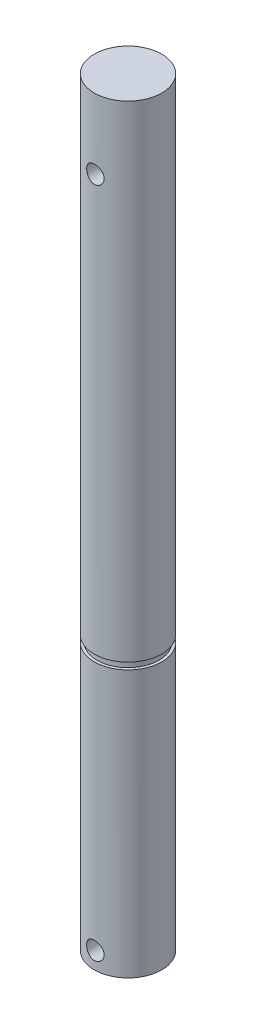
ISO-10303-21;
HEADER;
FILE_DESCRIPTION(('STEP AP214'),'2;1');
FILE_NAME('part.step','',(''),(''),'','','');
FILE_SCHEMA(('AUTOMOTIVE_DESIGN { 1 0 10303 214 1 1 1 1 }'));
ENDSEC;
DATA;
#1=APPLICATION_CONTEXT('core data for automotive mechanical design processes');
#2=APPLICATION_PROTOCOL_DEFINITION('international standard','automotive_design',2000,#1);
#3=PRODUCT_CONTEXT('',#1,'mechanical');
#4=PRODUCT('Part','Part','',(#3));
#5=PRODUCT_RELATED_PRODUCT_CATEGORY('part','',(#4));
#6=PRODUCT_DEFINITION_FORMATION('','',#4);
#7=PRODUCT_DEFINITION_CONTEXT('part definition',#1,'design');
#8=PRODUCT_DEFINITION('design','',#6,#7);
#9=PRODUCT_DEFINITION_SHAPE('','',#8);
#10=(LENGTH_UNIT() NAMED_UNIT(*) SI_UNIT(.MILLI.,.METRE.));
#11=(NAMED_UNIT(*) PLANE_ANGLE_UNIT() SI_UNIT($,.RADIAN.));
#12=(NAMED_UNIT(*) SI_UNIT($,.STERADIAN.) SOLID_ANGLE_UNIT());
#13=UNCERTAINTY_MEASURE_WITH_UNIT(LENGTH_MEASURE(1.E-05),#10,'distance_accuracy_value','');
#14=(GEOMETRIC_REPRESENTATION_CONTEXT(3) GLOBAL_UNCERTAINTY_ASSIGNED_CONTEXT((#13)) GLOBAL_UNIT_ASSIGNED_CONTEXT((#10,
#11,#12)) REPRESENTATION_CONTEXT('',''));
#15=CARTESIAN_POINT('',(0.,0.,0.));
#16=DIRECTION('',(0.,0.,1.));
#17=DIRECTION('',(1.,0.,0.));
#18=AXIS2_PLACEMENT_3D('',#15,#16,#17);
#19=CARTESIAN_POINT('',(0.,38.1,0.));
#20=DIRECTION('',(0.,-1.,0.));
#21=DIRECTION('',(0.,0.,-1.));
#22=AXIS2_PLACEMENT_3D('',#19,#20,#21);
#23=CYLINDRICAL_SURFACE('',#22,3.175);
#24=CARTESIAN_POINT('',(0.,-8.24230000000151,0.));
#25=DIRECTION('',(0.,-1.,0.));
#26=DIRECTION('',(1.,0.,0.));
#27=AXIS2_PLACEMENT_3D('',#24,#25,#26);
#28=CIRCLE('',#27,3.17500000000024);
#29=CARTESIAN_POINT('',(3.17500000000018,-8.24230000000153,0.));
#30=VERTEX_POINT('',#29);
#31=EDGE_CURVE('E85',#30,#30,#28,.T.);
#32=ORIENTED_EDGE('',*,*,#31,.T.);
#33=EDGE_LOOP('',(#32));
#34=FACE_BOUND('',#33,.T.);
#35=CARTESIAN_POINT('',(0.,-30.9181499999997,-3.175));
#36=CARTESIAN_POINT('',(-0.0455490444564716,-30.9181511646776,-3.17499927554408));
#37=CARTESIAN_POINT('',(-0.0911107772315206,-30.9219325825618,-3.17401012453183));
#38=CARTESIAN_POINT('',(-0.180924462571168,-30.9369332522701,-3.17016017836612));
#39=CARTESIAN_POINT('',(-0.225175727003084,-30.9481563418591,-3.16729841749395));
#40=CARTESIAN_POINT('',(-0.311058847949402,-30.9776528692705,-3.16001953568299));
#41=CARTESIAN_POINT('',(-0.352693912176376,-30.995917469299,-3.1556043650322));
#42=CARTESIAN_POINT('',(-0.432309574750794,-31.0389464647744,-3.14568673488206));
#43=CARTESIAN_POINT('',(-0.470289977745236,-31.0637112074107,-3.14018421730859));
#44=CARTESIAN_POINT('',(-0.542358916081396,-31.1196163924182,-3.1285511255792));
#45=CARTESIAN_POINT('',(-0.576355024960985,-31.1508738419514,-3.12241023686842));
#46=CARTESIAN_POINT('',(-0.638686440557507,-31.2186268750115,-3.11025967562153));
#47=CARTESIAN_POINT('',(-0.667021055984994,-31.2551230972783,-3.10425001918907));
#48=CARTESIAN_POINT('',(-0.717669305807227,-31.3330472453525,-3.09293747588305));
#49=CARTESIAN_POINT('',(-0.739877808562356,-31.3745455707403,-3.08764763606786));
#50=CARTESIAN_POINT('',(-0.776966698788749,-31.4608466590459,-3.07852481880321));
#51=CARTESIAN_POINT('',(-0.791848363714491,-31.5056488443592,-3.07469158741664));
#52=CARTESIAN_POINT('',(-0.813542460350865,-31.5962651979148,-3.06902229812762));
#53=CARTESIAN_POINT('',(-0.820521906643798,-31.6420367383294,-3.06714497298997));
#54=CARTESIAN_POINT('',(-0.826733950842547,-31.7341365760683,-3.06547666474802));
#55=CARTESIAN_POINT('',(-0.825967919338086,-31.7804647734409,-3.06568531252335));
#56=CARTESIAN_POINT('',(-0.816843613992,-31.8710689176488,-3.06812837577967));
#57=CARTESIAN_POINT('',(-0.80868616989106,-31.9153667621734,-3.07030920275975));
#58=CARTESIAN_POINT('',(-0.785331729461165,-32.0019424663515,-3.07636525914382));
#59=CARTESIAN_POINT('',(-0.77013419533119,-32.0442201714119,-3.08024061799389));
#60=CARTESIAN_POINT('',(-0.73296429277048,-32.1260850818811,-3.08929704174821));
#61=CARTESIAN_POINT('',(-0.710920512156943,-32.1656382893351,-3.09449175940506));
#62=CARTESIAN_POINT('',(-0.660733727053371,-32.2405554196189,-3.10559409871122));
#63=CARTESIAN_POINT('',(-0.632589575825033,-32.2759185528693,-3.11150185430367));
#64=CARTESIAN_POINT('',(-0.56996863358989,-32.3426005545741,-3.12358872711053));
#65=CARTESIAN_POINT('',(-0.53532285439119,-32.3737604433018,-3.12977058489188));
#66=CARTESIAN_POINT('',(-0.461222592708053,-32.4298594919214,-3.14154484108114));
#67=CARTESIAN_POINT('',(-0.421767938840292,-32.4547984300085,-3.14713721846733));
#68=CARTESIAN_POINT('',(-0.338931601167057,-32.4978128812965,-3.15713404940261));
#69=CARTESIAN_POINT('',(-0.295534986205322,-32.5158608265384,-3.1615337114748));
#70=CARTESIAN_POINT('',(-0.206183396301658,-32.5443599168877,-3.16861468064551));
#71=CARTESIAN_POINT('',(-0.160228954065163,-32.554812637487,-3.1712963440981));
#72=CARTESIAN_POINT('',(-0.0684239586743234,-32.5675777285026,-3.17458574406668));
#73=CARTESIAN_POINT('',(-0.0226054081557788,-32.5701063859497,-3.17524857017345));
#74=CARTESIAN_POINT('',(0.0688006995751029,-32.5675472110495,-3.17458339572571));
#75=CARTESIAN_POINT('',(0.114388278961209,-32.5624601242867,-3.17325559005482));
#76=CARTESIAN_POINT('',(0.203274715269327,-32.5449916424451,-3.16879381748649));
#77=CARTESIAN_POINT('',(0.246598691909961,-32.5327298092317,-3.1656894735007));
#78=CARTESIAN_POINT('',(0.330571383093773,-32.5013978167975,-3.15802578773359));
#79=CARTESIAN_POINT('',(0.371219814811472,-32.4823269391734,-3.15346629242869));
#80=CARTESIAN_POINT('',(0.449536179930653,-32.4375097314605,-3.14326779757461));
#81=CARTESIAN_POINT('',(0.487133469185669,-32.4116443210533,-3.13761006575121));
#82=CARTESIAN_POINT('',(0.557530280334611,-32.354122984244,-3.12586961024121));
#83=CARTESIAN_POINT('',(0.590328901114482,-32.3224659727763,-3.11978680704899));
#84=CARTESIAN_POINT('',(0.651100635474968,-32.2532526746999,-3.10768085425103));
#85=CARTESIAN_POINT('',(0.678921487901201,-32.2155614209022,-3.10166363600489));
#86=CARTESIAN_POINT('',(0.72784524484951,-32.1359193238853,-3.09054980997123));
#87=CARTESIAN_POINT('',(0.748948439062981,-32.093968664451,-3.08545316248925));
#88=CARTESIAN_POINT('',(0.783679117411295,-32.0072155734125,-3.07681531259225));
#89=CARTESIAN_POINT('',(0.797350495109814,-31.9624316693394,-3.07326500256863));
#90=CARTESIAN_POINT('',(0.81693857263891,-31.8710934110704,-3.0681168301153));
#91=CARTESIAN_POINT('',(0.822857136007982,-31.8245394851028,-3.06651849849617));
#92=CARTESIAN_POINT('',(0.826668323885045,-31.7325376056019,-3.06549306340449));
#93=CARTESIAN_POINT('',(0.824805100001955,-31.6871003467695,-3.06599990777189));
#94=CARTESIAN_POINT('',(0.813668869986645,-31.5972118465091,-3.0689738539894));
#95=CARTESIAN_POINT('',(0.804396037010227,-31.5527605820644,-3.07144091003115));
#96=CARTESIAN_POINT('',(0.778842083577236,-31.4663961241537,-3.07801899221736));
#97=CARTESIAN_POINT('',(0.762610281236707,-31.4244673944751,-3.08211843536613));
#98=CARTESIAN_POINT('',(0.723637682259986,-31.3438972876927,-3.09150019493008));
#99=CARTESIAN_POINT('',(0.700895911604898,-31.3052564036382,-3.09678268832701));
#100=CARTESIAN_POINT('',(0.648798632693577,-31.2311875582838,-3.10812062045323));
#101=CARTESIAN_POINT('',(0.619275367319419,-31.1958802583928,-3.11419359607686));
#102=CARTESIAN_POINT('',(0.554775411134822,-31.1306416535094,-3.1263275975947));
#103=CARTESIAN_POINT('',(0.519797409689423,-31.1007116442731,-3.13238862026157));
#104=CARTESIAN_POINT('',(0.444535305328722,-31.0464897572141,-3.14396086896678));
#105=CARTESIAN_POINT('',(0.404158949775694,-31.0223228272188,-3.14945864995091));
#106=CARTESIAN_POINT('',(0.319775904451884,-30.9811580024063,-3.15914011172934));
#107=CARTESIAN_POINT('',(0.275771679860848,-30.9641552866524,-3.163324675727));
#108=CARTESIAN_POINT('',(0.193246051545757,-30.9401446621499,-3.16933532392994));
#109=CARTESIAN_POINT('',(0.155096102604298,-30.9319152715346,-3.1714444631155));
#110=CARTESIAN_POINT('',(0.0779671520321311,-30.9209176840155,-3.17427704979612));
#111=CARTESIAN_POINT('',(0.0389882241908118,-30.9181490030804,-3.17500062010631));
#112=CARTESIAN_POINT('',(0.,-30.9181499999997,-3.175));
#113=B_SPLINE_CURVE_WITH_KNOTS('',3,(#35,#36,#37,#38,#39,#40,#41,#42,#43,#44,#45,#46,#47,#48,
#49,#50,#51,#52,#53,#54,#55,#56,#57,#58,#59,#60,#61,#62,#63,#64,#65,#66,#67,#68,#69,#70,#71,#72,
#73,#74,#75,#76,#77,#78,#79,#80,#81,#82,#83,#84,#85,#86,#87,#88,#89,#90,#91,#92,#93,#94,#95,#96,
#97,#98,#99,#100,#101,#102,#103,#104,#105,#106,#107,#108,#109,#110,#111,#112),.UNSPECIFIED.,.T.,
.F.,(4,2,2,2,2,2,2,2,2,2,2,2,2,2,2,2,2,2,2,2,2,2,2,2,2,2,2,2,2,2,2,2,2,2,2,2,2,2,4),(0.,
0.136504195516217,0.27307884279243,0.409482630473636,0.545893705315701,0.68501778706123,
0.824158846008316,0.965557110119736,1.10693071231387,1.24525707217547,1.38355895512629,
1.51821219335536,1.65287571960539,1.78899395896746,1.92513780785196,2.06549389557272,
2.20585498690284,2.34677186271358,2.48765949951733,2.62466653822042,2.76166016475649,
2.89643341067608,3.03122088035046,3.16854964487622,3.30590416456418,3.44692684984094,
3.58794345285013,3.72811788003193,3.86825860739928,4.00403602781559,4.13981027533032,
4.27463779836869,4.40948550480133,4.54811910168542,4.68678606018117,4.82823068230768,
4.96957997104779,5.08643265249317,5.20327497577964),.UNSPECIFIED.);
#114=CARTESIAN_POINT('',(0.,-30.9181499999997,-3.175));
#115=VERTEX_POINT('',#114);
#116=EDGE_CURVE('E10',#115,#115,#113,.T.);
#117=ORIENTED_EDGE('',*,*,#116,.T.);
#118=EDGE_LOOP('',(#117));
#119=FACE_BOUND('',#118,.T.);
#120=CARTESIAN_POINT('',(0.825499999999999,-31.7436499999997,3.06580735696162));
#121=CARTESIAN_POINT('',(0.825498819353765,-31.7891696967353,3.06580818336741));
#122=CARTESIAN_POINT('',(0.821722104839219,-31.834702113749,3.06683221886301));
#123=CARTESIAN_POINT('',(0.806741807375407,-31.9244549971676,3.07080619537846));
#124=CARTESIAN_POINT('',(0.795534257131288,-31.9686747495629,3.07375716516842));
#125=CARTESIAN_POINT('',(0.766083135905739,-32.0544910184032,3.08122870995301));
#126=CARTESIAN_POINT('',(0.747849126899335,-32.096091010833,3.08574715102012));
#127=CARTESIAN_POINT('',(0.704892310743453,-32.1756472056389,3.09584182879919));
#128=CARTESIAN_POINT('',(0.680169091621299,-32.2136031764623,3.10141813266419));
#129=CARTESIAN_POINT('',(0.62430709977595,-32.2856967235182,3.11314879863979));
#130=CARTESIAN_POINT('',(0.59304196757443,-32.3197348083738,3.11931300208702));
#131=CARTESIAN_POINT('',(0.525255577822254,-32.3821480829974,3.13143980057425));
#132=CARTESIAN_POINT('',(0.488733798225665,-32.4105227096498,3.13740237551749));
#133=CARTESIAN_POINT('',(0.410784322061856,-32.4612153069338,3.14856353496262));
#134=CARTESIAN_POINT('',(0.369290594041035,-32.4834348438452,3.15374915423211));
#135=CARTESIAN_POINT('',(0.282999322975401,-32.5205453678208,3.16265946662058));
#136=CARTESIAN_POINT('',(0.238202309857222,-32.5354375274448,3.16638439346674));
#137=CARTESIAN_POINT('',(0.147614066340619,-32.5571499176819,3.17188404162975));
#138=CARTESIAN_POINT('',(0.101865892555165,-32.5641392739458,3.17369956378193));
#139=CARTESIAN_POINT('',(0.00981271872407027,-32.5703792567927,3.17531830422215));
#140=CARTESIAN_POINT('',(-0.0364921913772237,-32.5696311170745,3.17512184330927));
#141=CARTESIAN_POINT('',(-0.127168941459509,-32.5605374786716,3.172768842575));
#142=CARTESIAN_POINT('',(-0.171560507746301,-32.552374635202,3.17065942882624));
#143=CARTESIAN_POINT('',(-0.258320746883839,-32.5289777814276,3.16477284587167));
#144=CARTESIAN_POINT('',(-0.300689307214236,-32.5137433783042,3.16099558401899));
#145=CARTESIAN_POINT('',(-0.382673201827478,-32.4764927055089,3.15212692930032));
#146=CARTESIAN_POINT('',(-0.422258275977102,-32.4544128713715,3.14702329518787));
#147=CARTESIAN_POINT('',(-0.497224359453583,-32.4041466530966,3.13605331458464));
#148=CARTESIAN_POINT('',(-0.532604582826892,-32.3759591301059,3.13018682593199));
#149=CARTESIAN_POINT('',(-0.599246567069803,-32.3133041346739,3.11812606817361));
#150=CARTESIAN_POINT('',(-0.630357768298053,-32.2786772211888,3.11192723020526));
#151=CARTESIAN_POINT('',(-0.686367146258403,-32.2046330696167,3.10005598775052));
#152=CARTESIAN_POINT('',(-0.711264981746744,-32.1652155686029,3.09438361218867));
#153=CARTESIAN_POINT('',(-0.754247988251561,-32.0823954176229,3.08418999149231));
#154=CARTESIAN_POINT('',(-0.772294151891635,-32.0389716491539,3.07967538353324));
#155=CARTESIAN_POINT('',(-0.800781689335441,-31.9495602316185,3.07239194406964));
#156=CARTESIAN_POINT('',(-0.811224842646535,-31.9035731852096,3.0696227040769));
#157=CARTESIAN_POINT('',(-0.823954349520303,-31.8117438922408,3.06623005045115));
#158=CARTESIAN_POINT('',(-0.826464488180476,-31.7659348059899,3.06554778299051));
#159=CARTESIAN_POINT('',(-0.823871691262388,-31.6745517888212,3.06624563374019));
#160=CARTESIAN_POINT('',(-0.81876952080856,-31.6289778347319,3.06762554467794));
#161=CARTESIAN_POINT('',(-0.801293796415369,-31.5402081959786,3.07223560538978));
#162=CARTESIAN_POINT('',(-0.789053035003952,-31.4969844432972,3.07543193890888));
#163=CARTESIAN_POINT('',(-0.757796059573932,-31.4132030210829,3.08328204054584));
#164=CARTESIAN_POINT('',(-0.738778993565462,-31.3726456875607,3.08793599192218));
#165=CARTESIAN_POINT('',(-0.694049202071332,-31.2944072484516,3.09829901067558));
#166=CARTESIAN_POINT('',(-0.668204093167924,-31.2568045545848,3.10402820657893));
#167=CARTESIAN_POINT('',(-0.610717295172369,-31.1863876527558,3.11584800458479));
#168=CARTESIAN_POINT('',(-0.579074572282191,-31.1535743006798,3.12193867101152));
#169=CARTESIAN_POINT('',(-0.509858935602981,-31.0927477282269,3.1339964773128));
#170=CARTESIAN_POINT('',(-0.472147676430613,-31.0648900605211,3.13995570189002));
#171=CARTESIAN_POINT('',(-0.392453494644261,-31.0159015623155,3.15090789666868));
#172=CARTESIAN_POINT('',(-0.350470798539792,-30.994770375363,3.1559009180661));
#173=CARTESIAN_POINT('',(-0.263719793390939,-30.9600247965308,3.16432613899056));
#174=CARTESIAN_POINT('',(-0.218974852380727,-30.9463549762543,3.16776981357496));
#175=CARTESIAN_POINT('',(-0.127720610486654,-30.9267569131268,3.17275873358125));
#176=CARTESIAN_POINT('',(-0.0812116820169368,-30.9208270454714,3.17430437744195));
#177=CARTESIAN_POINT('',(0.0107938349834537,-30.9169748016404,3.17530530527986));
#178=CARTESIAN_POINT('',(0.0562803364422382,-30.9188236986193,3.17482030052508));
#179=CARTESIAN_POINT('',(0.146271243305072,-30.9299483469188,3.17194839366885));
#180=CARTESIAN_POINT('',(0.190775682330615,-30.9392238435787,3.1695615567819));
#181=CARTESIAN_POINT('',(0.277278507096159,-30.9648116970439,3.16316497496677));
#182=CARTESIAN_POINT('',(0.31929082295442,-30.9810796900906,3.15916547131553));
#183=CARTESIAN_POINT('',(0.400013578327446,-31.0201509378772,3.149962929601));
#184=CARTESIAN_POINT('',(0.438723572134386,-31.0429550729821,3.14475972942786));
#185=CARTESIAN_POINT('',(0.512815813839564,-31.0951321541463,3.13354209270721));
#186=CARTESIAN_POINT('',(0.548087612058402,-31.1246582053346,3.12751030972759));
#187=CARTESIAN_POINT('',(0.613253362986662,-31.1891478066394,3.11538862754199));
#188=CARTESIAN_POINT('',(0.643145920246661,-31.22411276331,3.10929871368627));
#189=CARTESIAN_POINT('',(0.697312677045851,-31.2993549700526,3.09760640468102));
#190=CARTESIAN_POINT('',(0.721458367686669,-31.3397268639717,3.09201664595259));
#191=CARTESIAN_POINT('',(0.762584610191621,-31.4240971906979,3.08213240037602));
#192=CARTESIAN_POINT('',(0.77957006585795,-31.4680931167626,3.07783702762358));
#193=CARTESIAN_POINT('',(0.803545017555111,-31.5505770576642,3.07165503980121));
#194=CARTESIAN_POINT('',(0.811759379038496,-31.5886918598561,3.06947938784401));
#195=CARTESIAN_POINT('',(0.82273709854766,-31.6657513927147,3.06655526531629));
#196=CARTESIAN_POINT('',(0.825501010350486,-31.7046960386612,3.06580664975614));
#197=CARTESIAN_POINT('',(0.825499999999999,-31.7436499999997,3.06580735696162));
#198=B_SPLINE_CURVE_WITH_KNOTS('',3,(#120,#121,#122,#123,#124,#125,#126,#127,#128,#129,#130,
#131,#132,#133,#134,#135,#136,#137,#138,#139,#140,#141,#142,#143,#144,#145,#146,#147,#148,#149,
#150,#151,#152,#153,#154,#155,#156,#157,#158,#159,#160,#161,#162,#163,#164,#165,#166,#167,#168,
#169,#170,#171,#172,#173,#174,#175,#176,#177,#178,#179,#180,#181,#182,#183,#184,#185,#186,#187,
#188,#189,#190,#191,#192,#193,#194,#195,#196,#197),.UNSPECIFIED.,.T.,.F.,(4,2,2,2,2,2,2,2,2,2,2,
2,2,2,2,2,2,2,2,2,2,2,2,2,2,2,2,2,2,2,2,2,2,2,2,2,2,2,4),(0.,0.136415928666177,
0.272904747987364,0.409208478364227,0.545520864185939,0.684760232865413,0.824013439179415,
0.965379608350282,1.10672314810962,1.24498092447471,1.38321665677862,1.51813676574228,
1.65306437029205,1.7892844220938,1.92552989568013,2.06575668742531,2.20599117886077,
2.34701247955022,2.48800076316107,2.62497463283621,2.76193473599284,2.89642488147052,
3.03093194246523,3.16826732657767,3.30562722344135,3.44673816263475,3.5878416227695,
3.72788208209212,3.86789313878349,4.0038165280342,4.1397352566242,4.27480409300172,
4.40989113060397,4.54843360761921,4.68701197281954,4.8284467824469,4.96978457017739,
5.08653580497246,5.20327517698744),.UNSPECIFIED.);
#199=CARTESIAN_POINT('',(0.825499999999999,-31.7436499999997,3.06580735696162));
#200=VERTEX_POINT('',#199);
#201=EDGE_CURVE('E43',#200,#200,#198,.T.);
#202=ORIENTED_EDGE('',*,*,#201,.T.);
#203=EDGE_LOOP('',(#202));
#204=FACE_BOUND('',#203,.T.);
#205=CARTESIAN_POINT('',(0.,-33.3375,0.));
#206=DIRECTION('',(0.,-1.,0.));
#207=DIRECTION('',(0.,0.,-1.));
#208=AXIS2_PLACEMENT_3D('',#205,#206,#207);
#209=CIRCLE('',#208,3.175);
#210=CARTESIAN_POINT('',(0.,-33.3375,-3.175));
#211=VERTEX_POINT('',#210);
#212=EDGE_CURVE('E82',#211,#211,#209,.T.);
#213=ORIENTED_EDGE('',*,*,#212,.F.);
#214=EDGE_LOOP('',(#213));
#215=FACE_BOUND('',#214,.T.);
#216=ADVANCED_FACE('F33',(#34,#119,#204,#215),#23,.T.);
#217=CARTESIAN_POINT('',(0.,-33.3375,0.163997738638955));
#218=DIRECTION('',(0.,-1.,0.));
#219=DIRECTION('',(0.,0.,-1.));
#220=AXIS2_PLACEMENT_3D('',#217,#218,#219);
#221=PLANE('',#220);
#222=ORIENTED_EDGE('',*,*,#212,.T.);
#223=EDGE_LOOP('',(#222));
#224=FACE_BOUND('',#223,.T.);
#225=ADVANCED_FACE('F64',(#224),#221,.T.);
#226=CARTESIAN_POINT('',(0.,-31.7436499999997,-3.175));
#227=DIRECTION('',(0.,0.,1.));
#228=DIRECTION('',(1.,0.,0.));
#229=AXIS2_PLACEMENT_3D('',#226,#227,#228);
#230=CYLINDRICAL_SURFACE('',#229,0.825499999999999);
#231=ORIENTED_EDGE('',*,*,#201,.F.);
#232=EDGE_LOOP('',(#231));
#233=FACE_BOUND('',#232,.T.);
#234=ORIENTED_EDGE('',*,*,#116,.F.);
#235=EDGE_LOOP('',(#234));
#236=FACE_BOUND('',#235,.T.);
#237=ADVANCED_FACE('F59',(#233,#236),#230,.F.);
#238=CARTESIAN_POINT('',(0.,-8.24230000000151,0.));
#239=DIRECTION('',(0.,-1.,0.));
#240=DIRECTION('',(1.,0.,0.));
#241=AXIS2_PLACEMENT_3D('',#238,#239,#240);
#242=PLANE('',#241);
#243=ORIENTED_EDGE('',*,*,#31,.F.);
#244=EDGE_LOOP('',(#243));
#245=FACE_BOUND('',#244,.T.);
#246=CARTESIAN_POINT('',(0.,-8.24230000000151,0.));
#247=DIRECTION('',(0.,-1.,0.));
#248=DIRECTION('',(1.,0.,0.));
#249=AXIS2_PLACEMENT_3D('',#246,#247,#248);
#250=CIRCLE('',#249,2.91670568167633);
#251=CARTESIAN_POINT('',(2.91670568167628,-8.24230000000153,0.));
#252=VERTEX_POINT('',#251);
#253=EDGE_CURVE('E91',#252,#252,#250,.T.);
#254=ORIENTED_EDGE('',*,*,#253,.T.);
#255=EDGE_LOOP('',(#254));
#256=FACE_BOUND('',#255,.T.);
#257=ADVANCED_FACE('F63',(#245,#256),#242,.F.);
#258=CARTESIAN_POINT('',(0.,-7.60730000000151,0.));
#259=DIRECTION('',(0.,-1.,0.));
#260=DIRECTION('',(1.,0.,0.));
#261=AXIS2_PLACEMENT_3D('',#258,#259,#260);
#262=PLANE('',#261);
#263=CARTESIAN_POINT('',(0.,-7.60730000000151,0.));
#264=DIRECTION('',(0.,-1.,0.));
#265=DIRECTION('',(1.,0.,0.));
#266=AXIS2_PLACEMENT_3D('',#263,#264,#265);
#267=CIRCLE('',#266,3.17500000000024);
#268=CARTESIAN_POINT('',(3.17500000000019,-7.60730000000153,0.));
#269=VERTEX_POINT('',#268);
#270=EDGE_CURVE('E88',#269,#269,#267,.T.);
#271=ORIENTED_EDGE('',*,*,#270,.T.);
#272=EDGE_LOOP('',(#271));
#273=FACE_BOUND('',#272,.T.);
#274=CARTESIAN_POINT('',(0.,-7.60730000000151,0.));
#275=DIRECTION('',(0.,-1.,0.));
#276=DIRECTION('',(1.,0.,0.));
#277=AXIS2_PLACEMENT_3D('',#274,#275,#276);
#278=CIRCLE('',#277,2.91670568167633);
#279=CARTESIAN_POINT('',(2.91670568167628,-7.60730000000153,0.));
#280=VERTEX_POINT('',#279);
#281=EDGE_CURVE('E94',#280,#280,#278,.T.);
#282=ORIENTED_EDGE('',*,*,#281,.F.);
#283=EDGE_LOOP('',(#282));
#284=FACE_BOUND('',#283,.T.);
#285=ADVANCED_FACE('F66',(#273,#284),#262,.T.);
#286=CARTESIAN_POINT('',(0.,-8.24230000000151,0.));
#287=DIRECTION('',(0.,1.,0.));
#288=DIRECTION('',(-1.,0.,0.));
#289=AXIS2_PLACEMENT_3D('',#286,#287,#288);
#290=CYLINDRICAL_SURFACE('',#289,2.91670568167633);
#291=ORIENTED_EDGE('',*,*,#253,.F.);
#292=EDGE_LOOP('',(#291));
#293=FACE_BOUND('',#292,.T.);
#294=ORIENTED_EDGE('',*,*,#281,.T.);
#295=EDGE_LOOP('',(#294));
#296=FACE_BOUND('',#295,.T.);
#297=ADVANCED_FACE('F74',(#293,#296),#290,.T.);
#298=CARTESIAN_POINT('',(0.,31.4892710191616,-3.175));
#299=DIRECTION('',(0.,0.,1.));
#300=DIRECTION('',(1.,0.,0.));
#301=AXIS2_PLACEMENT_3D('',#298,#299,#300);
#302=CYLINDRICAL_SURFACE('',#301,0.825500000001063);
#303=CARTESIAN_POINT('',(0.825500000001118,31.4892710191616,3.06580735696132));
#304=CARTESIAN_POINT('',(0.825498819354884,31.443751322426,3.06580818336711));
#305=CARTESIAN_POINT('',(0.821722104840333,31.3982189054123,3.06683221886271));
#306=CARTESIAN_POINT('',(0.806741807376503,31.3084660219935,3.07080619537817));
#307=CARTESIAN_POINT('',(0.795534257132371,31.2642462695982,3.07375716516814));
#308=CARTESIAN_POINT('',(0.766083135906788,31.1784300007578,3.08122870995275));
#309=CARTESIAN_POINT('',(0.747849126900364,31.1368300083279,3.08574715101987));
#310=CARTESIAN_POINT('',(0.704892310744433,31.0572738135219,3.09584182879897));
#311=CARTESIAN_POINT('',(0.680169091622251,31.0193178426984,3.10141813266398));
#312=CARTESIAN_POINT('',(0.624307099776839,30.9472242956425,3.11314879863961));
#313=CARTESIAN_POINT('',(0.593041967575281,30.9131862107869,3.11931300208686));
#314=CARTESIAN_POINT('',(0.525255577823022,30.8507729361631,3.13143980057412));
#315=CARTESIAN_POINT('',(0.488733798226387,30.8223983095108,3.13740237551738));
#316=CARTESIAN_POINT('',(0.41078432206248,30.7717057122266,3.14856353496254));
#317=CARTESIAN_POINT('',(0.369290594041605,30.7494861753152,3.15374915423205));
#318=CARTESIAN_POINT('',(0.282999322975857,30.7123756513395,3.16265946662054));
#319=CARTESIAN_POINT('',(0.238202309857618,30.6974834917155,3.16638439346671));
#320=CARTESIAN_POINT('',(0.147614066340897,30.6757711014784,3.17188404162974));
#321=CARTESIAN_POINT('',(0.101865892555384,30.6687817452145,3.17369956378193));
#322=CARTESIAN_POINT('',(0.00981271872417212,30.6625417623676,3.17531830422215));
#323=CARTESIAN_POINT('',(-0.0364921913771816,30.6632899020858,3.17512184330927));
#324=CARTESIAN_POINT('',(-0.127168941459581,30.6723835404887,3.17276884257499));
#325=CARTESIAN_POINT('',(-0.171560507746427,30.6805463839583,3.17065942882623));
#326=CARTESIAN_POINT('',(-0.25832074688407,30.7039432377327,3.16477284587165));
#327=CARTESIAN_POINT('',(-0.300689307214519,30.7191776408561,3.16099558401896));
#328=CARTESIAN_POINT('',(-0.382673201827864,30.7564283136515,3.15212692930028));
#329=CARTESIAN_POINT('',(-0.422258275977539,30.7785081477889,3.14702329518781));
#330=CARTESIAN_POINT('',(-0.497224359454117,30.8287743660638,3.13605331458455));
#331=CARTESIAN_POINT('',(-0.53260458282747,30.8569618890546,3.13018682593189));
#332=CARTESIAN_POINT('',(-0.599246567070468,30.9196168844867,3.11812606817348));
#333=CARTESIAN_POINT('',(-0.630357768298759,30.9542437979718,3.11192723020512));
#334=CARTESIAN_POINT('',(-0.686367146259187,31.028287949544,3.10005598775035));
#335=CARTESIAN_POINT('',(-0.711264981747565,31.0677054505578,3.09438361218848));
#336=CARTESIAN_POINT('',(-0.754247988252445,31.1505256015379,3.0841899914921));
#337=CARTESIAN_POINT('',(-0.772294151892547,31.193949370007,3.07967538353301));
#338=CARTESIAN_POINT('',(-0.800781689336399,31.2833607875425,3.07239194406939));
#339=CARTESIAN_POINT('',(-0.811224842647511,31.3293478339515,3.06962270407664));
#340=CARTESIAN_POINT('',(-0.823954349521305,31.4211771269204,3.06623005045088));
#341=CARTESIAN_POINT('',(-0.826464488181485,31.4669862131714,3.06554778299024));
#342=CARTESIAN_POINT('',(-0.823871691263402,31.5583692303402,3.06624563373991));
#343=CARTESIAN_POINT('',(-0.818769520809571,31.6039431844295,3.06762554467767));
#344=CARTESIAN_POINT('',(-0.801293796416366,31.6927128231829,3.07223560538952));
#345=CARTESIAN_POINT('',(-0.789053035004938,31.7359365758644,3.07543193890863));
#346=CARTESIAN_POINT('',(-0.757796059574889,31.8197179980788,3.08328204054561));
#347=CARTESIAN_POINT('',(-0.738778993566403,31.860275331601,3.08793599192195));
#348=CARTESIAN_POINT('',(-0.69404920207223,31.9385137707102,3.09829901067538));
#349=CARTESIAN_POINT('',(-0.668204093168795,31.9761164645771,3.10402820657875));
#350=CARTESIAN_POINT('',(-0.610717295173181,32.0465333664062,3.11584800458463));
#351=CARTESIAN_POINT('',(-0.57907457228297,32.0793467184822,3.12193867101138));
#352=CARTESIAN_POINT('',(-0.509858935603683,32.1401732909352,3.13399647731268));
#353=CARTESIAN_POINT('',(-0.472147676431269,32.168030958641,3.13995570188992));
#354=CARTESIAN_POINT('',(-0.392453494644821,32.2170194568468,3.15090789666861));
#355=CARTESIAN_POINT('',(-0.350470798540301,32.2381506437993,3.15590091806604));
#356=CARTESIAN_POINT('',(-0.263719793391339,32.2728962226315,3.16432613899053));
#357=CARTESIAN_POINT('',(-0.218974852381069,32.2865660429081,3.16776981357494));
#358=CARTESIAN_POINT('',(-0.127720610486878,32.3061641060356,3.17275873358125));
#359=CARTESIAN_POINT('',(-0.0812116820171007,32.312093973691,3.17430437744195));
#360=CARTESIAN_POINT('',(0.0107938349834074,32.315946217522,3.17530530527986));
#361=CARTESIAN_POINT('',(0.0562803364422488,32.3140973205431,3.17482030052508));
#362=CARTESIAN_POINT('',(0.146271243305196,32.3029726722436,3.17194839366885));
#363=CARTESIAN_POINT('',(0.190775682330794,32.2936971755837,3.16956155678189));
#364=CARTESIAN_POINT('',(0.27727850709645,32.2681093221185,3.16316497496674));
#365=CARTESIAN_POINT('',(0.319290822954765,32.2518413290718,3.15916547131549));
#366=CARTESIAN_POINT('',(0.400013578327895,32.2127700812852,3.14996292960095));
#367=CARTESIAN_POINT('',(0.438723572134884,32.1899659461802,3.14475972942779));
#368=CARTESIAN_POINT('',(0.512815813840161,32.137788865016,3.13354209270712));
#369=CARTESIAN_POINT('',(0.548087612059048,32.1082628138277,3.12751030972748));
#370=CARTESIAN_POINT('',(0.613253362987402,32.0437732125228,3.11538862754184));
#371=CARTESIAN_POINT('',(0.643145920247444,32.0088082558522,3.10929871368611));
#372=CARTESIAN_POINT('',(0.697312677046718,31.9335660491094,3.09760640468083));
#373=CARTESIAN_POINT('',(0.721458367687575,31.8931941551903,3.09201664595238));
#374=CARTESIAN_POINT('',(0.762584610192598,31.808823828464,3.08213240037578));
#375=CARTESIAN_POINT('',(0.779570065858957,31.7648279023993,3.07783702762333));
#376=CARTESIAN_POINT('',(0.803545017556172,31.6823439614976,3.07165503980093));
#377=CARTESIAN_POINT('',(0.811759379039579,31.6442291593056,3.06947938784373));
#378=CARTESIAN_POINT('',(0.822737098548771,31.5671696264468,3.06655526531599));
#379=CARTESIAN_POINT('',(0.825501010351605,31.5282249805003,3.06580664975584));
#380=CARTESIAN_POINT('',(0.825500000001118,31.4892710191616,3.06580735696132));
#381=B_SPLINE_CURVE_WITH_KNOTS('',3,(#303,#304,#305,#306,#307,#308,#309,#310,#311,#312,#313,
#314,#315,#316,#317,#318,#319,#320,#321,#322,#323,#324,#325,#326,#327,#328,#329,#330,#331,#332,
#333,#334,#335,#336,#337,#338,#339,#340,#341,#342,#343,#344,#345,#346,#347,#348,#349,#350,#351,
#352,#353,#354,#355,#356,#357,#358,#359,#360,#361,#362,#363,#364,#365,#366,#367,#368,#369,#370,
#371,#372,#373,#374,#375,#376,#377,#378,#379,#380),.UNSPECIFIED.,.T.,.F.,(4,2,2,2,2,2,2,2,2,2,2,
2,2,2,2,2,2,2,2,2,2,2,2,2,2,2,2,2,2,2,2,2,2,2,2,2,2,2,4),(0.,0.136415928666351,0.2729047479877,
0.409208478364731,0.545520864186608,0.68476023286626,0.82401343918044,0.9653796083515,
1.10672314811103,1.2449809244763,1.38321665678039,1.5181367657442,1.65306437029415,
1.78928442209606,1.92552989568256,2.06575668742792,2.20599117886356,2.34701247955319,
2.48800076316423,2.62497463283954,2.76193473599636,2.89642488147421,3.03093194246906,
3.16826732658167,3.30562722344552,3.44673816263911,3.58784162277404,3.72788208209686,
3.86789313878841,4.00381652803928,4.13973525662946,4.27480409300714,4.40989113060955,
4.54843360762497,4.68701197282548,4.82844678245302,4.96978457018371,5.086535804979,
5.20327517699421),.UNSPECIFIED.);
#382=CARTESIAN_POINT('',(0.825500000001118,31.4892710191616,3.06580735696132));
#383=VERTEX_POINT('',#382);
#384=EDGE_CURVE('E51',#383,#383,#381,.T.);
#385=ORIENTED_EDGE('',*,*,#384,.F.);
#386=EDGE_LOOP('',(#385));
#387=FACE_BOUND('',#386,.T.);
#388=CARTESIAN_POINT('',(0.,32.3147710191627,-3.175));
#389=CARTESIAN_POINT('',(-0.0455490444565295,32.3147698544848,-3.17499927554408));
#390=CARTESIAN_POINT('',(-0.0911107772316364,32.3109884366006,-3.17401012453182));
#391=CARTESIAN_POINT('',(-0.180924462571394,32.2959877668923,-3.17016017836611));
#392=CARTESIAN_POINT('',(-0.225175727003362,32.2847646773033,-3.16729841749393));
#393=CARTESIAN_POINT('',(-0.311058847949783,32.2552681498918,-3.16001953568295));
#394=CARTESIAN_POINT('',(-0.352693912176808,32.2370035498633,-3.15560436503215));
#395=CARTESIAN_POINT('',(-0.432309574751322,32.1939745543878,-3.14568673488198));
#396=CARTESIAN_POINT('',(-0.470289977745808,32.1692098117515,-3.1401842173085));
#397=CARTESIAN_POINT('',(-0.542358916082057,32.1133046267439,-3.12855112557908));
#398=CARTESIAN_POINT('',(-0.576355024961689,32.0820471772108,-3.12241023686829));
#399=CARTESIAN_POINT('',(-0.63868644055829,32.0142941441506,-3.11025967562137));
#400=CARTESIAN_POINT('',(-0.667021055985811,31.9777979218836,-3.1042500191889));
#401=CARTESIAN_POINT('',(-0.717669305808109,31.8998737738094,-3.09293747588285));
#402=CARTESIAN_POINT('',(-0.739877808563266,31.8583754484215,-3.08764763606764));
#403=CARTESIAN_POINT('',(-0.776966698789705,31.7720743601158,-3.07852481880296));
#404=CARTESIAN_POINT('',(-0.791848363715464,31.7272721748025,-3.07469158741639));
#405=CARTESIAN_POINT('',(-0.813542460351864,31.6366558212467,-3.06902229812736));
#406=CARTESIAN_POINT('',(-0.820521906644804,31.590884280832,-3.0671449729897));
#407=CARTESIAN_POINT('',(-0.826733950843558,31.4987844430931,-3.06547666474774));
#408=CARTESIAN_POINT('',(-0.825967919339095,31.4524562457203,-3.06568531252307));
#409=CARTESIAN_POINT('',(-0.816843613992996,31.3618521015124,-3.06812837577941));
#410=CARTESIAN_POINT('',(-0.808686169892045,31.3175542569878,-3.07030920275949));
#411=CARTESIAN_POINT('',(-0.785331729462121,31.2309785528095,-3.07636525914357));
#412=CARTESIAN_POINT('',(-0.770134195332129,31.188700847749,-3.08024061799366));
#413=CARTESIAN_POINT('',(-0.732964292771372,31.1068359372797,-3.089297041748));
#414=CARTESIAN_POINT('',(-0.710920512157806,31.0672827298257,-3.09449175940486));
#415=CARTESIAN_POINT('',(-0.660733727054174,30.9923655995418,-3.10559409871105));
#416=CARTESIAN_POINT('',(-0.632589575825804,30.9570024662914,-3.11150185430351));
#417=CARTESIAN_POINT('',(-0.569968633590584,30.8903204645865,-3.12358872711041));
#418=CARTESIAN_POINT('',(-0.535322854391839,30.8591605758588,-3.12977058489177));
#419=CARTESIAN_POINT('',(-0.461222592708607,30.8030615272391,-3.14154484108106));
#420=CARTESIAN_POINT('',(-0.421767938840797,30.778122589152,-3.14713721846727));
#421=CARTESIAN_POINT('',(-0.338931601167455,30.7351081378639,-3.15713404940257));
#422=CARTESIAN_POINT('',(-0.295534986205662,30.717060192622,-3.16153371147477));
#423=CARTESIAN_POINT('',(-0.20618339630188,30.6885611022727,-3.1686146806455));
#424=CARTESIAN_POINT('',(-0.160228954065326,30.6781083816733,-3.1712963440981));
#425=CARTESIAN_POINT('',(-0.0684239586743705,30.6653432906577,-3.17458574406668));
#426=CARTESIAN_POINT('',(-0.0226054081557688,30.6628146332106,-3.17524857017345));
#427=CARTESIAN_POINT('',(0.0688006995752264,30.6653738081108,-3.1745833957257));
#428=CARTESIAN_POINT('',(0.114388278961389,30.6704608948736,-3.17325559005481));
#429=CARTESIAN_POINT('',(0.203274715269616,30.6879293767152,-3.16879381748648));
#430=CARTESIAN_POINT('',(0.246598691910303,30.7001912099286,-3.16568947350068));
#431=CARTESIAN_POINT('',(0.330571383094218,30.7315232023629,-3.15802578773354));
#432=CARTESIAN_POINT('',(0.371219814811965,30.750594079987,-3.15346629242863));
#433=CARTESIAN_POINT('',(0.449536179931244,30.7954112876999,-3.14326779757452));
#434=CARTESIAN_POINT('',(0.487133469186308,30.8212766981072,-3.13761006575112));
#435=CARTESIAN_POINT('',(0.557530280335341,30.8787980349165,-3.12586961024108));
#436=CARTESIAN_POINT('',(0.590328901115254,30.9104550463843,-3.11978680704885));
#437=CARTESIAN_POINT('',(0.651100635475821,30.9796683444607,-3.10768085425085));
#438=CARTESIAN_POINT('',(0.678921487902092,31.0173595982585,-3.10166363600469));
#439=CARTESIAN_POINT('',(0.727845244850471,31.0970016952755,-3.09054980997101));
#440=CARTESIAN_POINT('',(0.748948439063973,31.1389523547098,-3.08545316248901));
#441=CARTESIAN_POINT('',(0.783679117412339,31.2257054457485,-3.07681531259199));
#442=CARTESIAN_POINT('',(0.79735049511088,31.2704893498216,-3.07326500256835));
#443=CARTESIAN_POINT('',(0.816938572640008,31.3618276080908,-3.068116830115));
#444=CARTESIAN_POINT('',(0.822857136009091,31.4083815340583,-3.06651849849588));
#445=CARTESIAN_POINT('',(0.826668323886167,31.5003834135594,-3.06549306340419));
#446=CARTESIAN_POINT('',(0.824805100003077,31.5458206723919,-3.06599990777159));
#447=CARTESIAN_POINT('',(0.81366886998776,31.6357091726523,-3.0689738539891));
#448=CARTESIAN_POINT('',(0.804396037011333,31.6801604370971,-3.07144091003086));
#449=CARTESIAN_POINT('',(0.778842083578319,31.766524895008,-3.07801899221709));
#450=CARTESIAN_POINT('',(0.762610281237773,31.8084536246866,-3.08211843536586));
#451=CARTESIAN_POINT('',(0.723637682261014,31.8890237314691,-3.09150019492983));
#452=CARTESIAN_POINT('',(0.700895911605903,31.9276646155237,-3.09678268832678));
#453=CARTESIAN_POINT('',(0.648798632694527,32.0017334608781,-3.10812062045303));
#454=CARTESIAN_POINT('',(0.619275367320336,32.0370407607692,-3.11419359607668));
#455=CARTESIAN_POINT('',(0.554775411135669,32.1022793656527,-3.12632759759456));
#456=CARTESIAN_POINT('',(0.519797409690231,32.1322093748891,-3.13238862026144));
#457=CARTESIAN_POINT('',(0.444535305329442,32.1864312619481,-3.14396086896668));
#458=CARTESIAN_POINT('',(0.404158949776363,32.2105981919434,-3.14945864995083));
#459=CARTESIAN_POINT('',(0.319775904452447,32.2517630167559,-3.15914011172929));
#460=CARTESIAN_POINT('',(0.275771679861355,32.2687657325099,-3.16332467572695));
#461=CARTESIAN_POINT('',(0.193246051546135,32.2927763570125,-3.16933532392992));
#462=CARTESIAN_POINT('',(0.155096102604603,32.3010057476278,-3.17144446311549));
#463=CARTESIAN_POINT('',(0.0779671520322857,32.3120033351469,-3.17427704979611));
#464=CARTESIAN_POINT('',(0.038988224190889,32.314772016082,-3.17500062010631));
#465=CARTESIAN_POINT('',(0.,32.3147710191627,-3.175));
#466=B_SPLINE_CURVE_WITH_KNOTS('',3,(#388,#389,#390,#391,#392,#393,#394,#395,#396,#397,#398,
#399,#400,#401,#402,#403,#404,#405,#406,#407,#408,#409,#410,#411,#412,#413,#414,#415,#416,#417,
#418,#419,#420,#421,#422,#423,#424,#425,#426,#427,#428,#429,#430,#431,#432,#433,#434,#435,#436,
#437,#438,#439,#440,#441,#442,#443,#444,#445,#446,#447,#448,#449,#450,#451,#452,#453,#454,#455,
#456,#457,#458,#459,#460,#461,#462,#463,#464,#465),.UNSPECIFIED.,.T.,.F.,(4,2,2,2,2,2,2,2,2,2,2,
2,2,2,2,2,2,2,2,2,2,2,2,2,2,2,2,2,2,2,2,2,2,2,2,2,2,2,4),(0.,0.136504195516388,
0.273078842792768,0.40948263047414,0.545893705316376,0.685017787062087,0.824158846009354,
0.965557110120964,1.10693071231528,1.24525707217705,1.38355895512804,1.51821219335728,
1.65287571960748,1.78899395896972,1.92513780785439,2.06549389557534,2.20585498690564,
2.34677186271656,2.4876594995205,2.62466653822376,2.76166016476,2.89643341067975,
3.0312208803543,3.16854964488022,3.30590416456836,3.4469268498453,3.58794345285468,
3.72811788003666,3.86825860740419,4.00403602782068,4.13981027533558,4.27463779837412,
4.40948550480691,4.54811910169118,4.6867860601871,4.8282306823138,4.9695799710541,
5.08643265249971,5.20327497578641),.UNSPECIFIED.);
#467=CARTESIAN_POINT('',(0.,32.3147710191627,-3.175));
#468=VERTEX_POINT('',#467);
#469=EDGE_CURVE('E47',#468,#468,#466,.T.);
#470=ORIENTED_EDGE('',*,*,#469,.F.);
#471=EDGE_LOOP('',(#470));
#472=FACE_BOUND('',#471,.T.);
#473=ADVANCED_FACE('F68',(#387,#472),#302,.F.);
#474=CARTESIAN_POINT('',(0.,38.1,0.));
#475=DIRECTION('',(0.,1.,0.));
#476=DIRECTION('',(0.,0.,1.));
#477=AXIS2_PLACEMENT_3D('',#474,#475,#476);
#478=PLANE('',#477);
#479=CARTESIAN_POINT('',(0.,38.1,0.));
#480=DIRECTION('',(0.,1.,0.));
#481=DIRECTION('',(0.,0.,1.));
#482=AXIS2_PLACEMENT_3D('',#479,#480,#481);
#483=CIRCLE('',#482,3.175);
#484=CARTESIAN_POINT('',(0.,38.1,3.175));
#485=VERTEX_POINT('',#484);
#486=EDGE_CURVE('E81',#485,#485,#483,.T.);
#487=ORIENTED_EDGE('',*,*,#486,.T.);
#488=EDGE_LOOP('',(#487));
#489=FACE_BOUND('',#488,.T.);
#490=ADVANCED_FACE('F73',(#489),#478,.T.);
#491=ORIENTED_EDGE('',*,*,#486,.F.);
#492=EDGE_LOOP('',(#491));
#493=FACE_BOUND('',#492,.T.);
#494=ORIENTED_EDGE('',*,*,#384,.T.);
#495=EDGE_LOOP('',(#494));
#496=FACE_BOUND('',#495,.T.);
#497=ORIENTED_EDGE('',*,*,#469,.T.);
#498=EDGE_LOOP('',(#497));
#499=FACE_BOUND('',#498,.T.);
#500=ORIENTED_EDGE('',*,*,#270,.F.);
#501=EDGE_LOOP('',(#500));
#502=FACE_BOUND('',#501,.T.);
#503=ADVANCED_FACE('F114',(#493,#496,#499,#502),#23,.T.);
#504=CLOSED_SHELL('',(#216,#225,#237,#257,#285,#297,#473,#490,#503));
#505=MANIFOLD_SOLID_BREP('B2',#504);
#506=ADVANCED_BREP_SHAPE_REPRESENTATION('',(#18,#505),#14);
#507=SHAPE_DEFINITION_REPRESENTATION(#9,#506);
ENDSEC;
END-ISO-10303-21;
